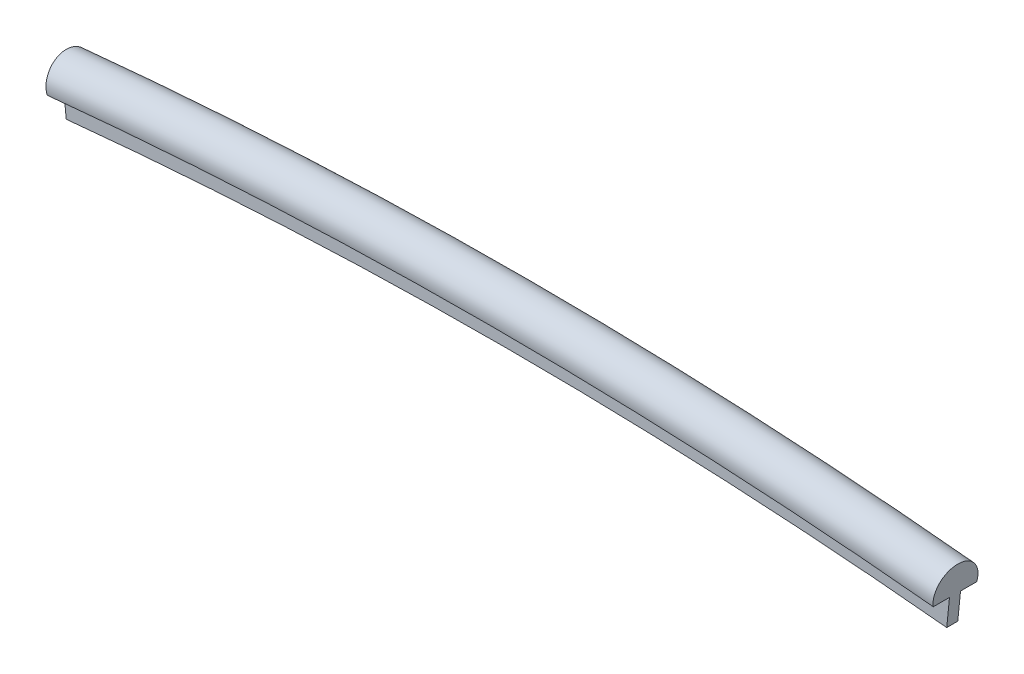
ISO-10303-21;
HEADER;
FILE_DESCRIPTION(('STEP AP214'),'2;1');
FILE_NAME('part.step','',(''),(''),'','','');
FILE_SCHEMA(('AUTOMOTIVE_DESIGN { 1 0 10303 214 1 1 1 1 }'));
ENDSEC;
DATA;
#1=APPLICATION_CONTEXT('core data for automotive mechanical design processes');
#2=APPLICATION_PROTOCOL_DEFINITION('international standard','automotive_design',2000,#1);
#3=PRODUCT_CONTEXT('',#1,'mechanical');
#4=PRODUCT('Part','Part','',(#3));
#5=PRODUCT_RELATED_PRODUCT_CATEGORY('part','',(#4));
#6=PRODUCT_DEFINITION_FORMATION('','',#4);
#7=PRODUCT_DEFINITION_CONTEXT('part definition',#1,'design');
#8=PRODUCT_DEFINITION('design','',#6,#7);
#9=PRODUCT_DEFINITION_SHAPE('','',#8);
#10=(LENGTH_UNIT() NAMED_UNIT(*) SI_UNIT(.MILLI.,.METRE.));
#11=(NAMED_UNIT(*) PLANE_ANGLE_UNIT() SI_UNIT($,.RADIAN.));
#12=(NAMED_UNIT(*) SI_UNIT($,.STERADIAN.) SOLID_ANGLE_UNIT());
#13=UNCERTAINTY_MEASURE_WITH_UNIT(LENGTH_MEASURE(1.E-05),#10,'distance_accuracy_value','');
#14=(GEOMETRIC_REPRESENTATION_CONTEXT(3) GLOBAL_UNCERTAINTY_ASSIGNED_CONTEXT((#13)) GLOBAL_UNIT_ASSIGNED_CONTEXT((#10,
#11,#12)) REPRESENTATION_CONTEXT('',''));
#15=CARTESIAN_POINT('',(0.,0.,0.));
#16=DIRECTION('',(0.,0.,1.));
#17=DIRECTION('',(1.,0.,0.));
#18=AXIS2_PLACEMENT_3D('',#15,#16,#17);
#19=CARTESIAN_POINT('',(0.,0.,70.5976415970385));
#20=DIRECTION('',(0.,0.,1.));
#21=DIRECTION('',(1.,0.,0.));
#22=AXIS2_PLACEMENT_3D('',#19,#20,#21);
#23=CYLINDRICAL_SURFACE('',#22,241.3);
#24=CARTESIAN_POINT('',(0.,0.,1.18));
#25=DIRECTION('',(0.,0.,1.));
#26=DIRECTION('',(1.,0.,0.));
#27=AXIS2_PLACEMENT_3D('',#24,#25,#26);
#28=CIRCLE('',#27,241.3);
#29=CARTESIAN_POINT('',(24.0400729481328,240.09948957182,1.18));
#30=VERTEX_POINT('',#29);
#31=CARTESIAN_POINT('',(-24.0400729481328,240.09948957182,1.18));
#32=VERTEX_POINT('',#31);
#33=EDGE_CURVE('E11',#30,#32,#28,.T.);
#34=ORIENTED_EDGE('',*,*,#33,.T.);
#35=DIRECTION('',(0.,0.,-1.));
#36=VECTOR('',#35,1.);
#37=CARTESIAN_POINT('',(-24.0400729481328,240.09948957182,1.18));
#38=LINE('',#37,#36);
#39=CARTESIAN_POINT('',(-24.0400729481328,240.09948957182,0.3));
#40=VERTEX_POINT('',#39);
#41=EDGE_CURVE('E103',#32,#40,#38,.T.);
#42=ORIENTED_EDGE('',*,*,#41,.T.);
#43=CARTESIAN_POINT('',(0.,0.,0.299999999999995));
#44=DIRECTION('',(0.,0.,1.));
#45=DIRECTION('',(1.,0.,0.));
#46=AXIS2_PLACEMENT_3D('',#43,#44,#45);
#47=CIRCLE('',#46,241.3);
#48=CARTESIAN_POINT('',(24.0400729481328,240.09948957182,0.3));
#49=VERTEX_POINT('',#48);
#50=EDGE_CURVE('E85',#49,#40,#47,.T.);
#51=ORIENTED_EDGE('',*,*,#50,.F.);
#52=DIRECTION('',(0.,0.,-1.));
#53=VECTOR('',#52,1.);
#54=CARTESIAN_POINT('',(24.0400729481328,240.09948957182,1.18));
#55=LINE('',#54,#53);
#56=EDGE_CURVE('E117',#30,#49,#55,.T.);
#57=ORIENTED_EDGE('',*,*,#56,.F.);
#58=EDGE_LOOP('',(#34,#42,#51,#57));
#59=FACE_BOUND('',#58,.T.);
#60=ADVANCED_FACE('F33',(#59),#23,.F.);
#61=CARTESIAN_POINT('',(0.,0.,0.));
#62=DIRECTION('',(0.,0.,1.));
#63=DIRECTION('',(1.,0.,0.));
#64=AXIS2_PLACEMENT_3D('',#61,#62,#63);
#65=TOROIDAL_SURFACE('',#64,241.586013989906,1.21416802890791);
#66=CARTESIAN_POINT('',(0.,0.,-1.18));
#67=DIRECTION('',(0.,0.,1.));
#68=DIRECTION('',(1.,0.,0.));
#69=AXIS2_PLACEMENT_3D('',#66,#67,#68);
#70=CIRCLE('',#69,241.3);
#71=CARTESIAN_POINT('',(24.0400729481328,240.09948957182,-1.18));
#72=VERTEX_POINT('',#71);
#73=CARTESIAN_POINT('',(-24.0400729481328,240.09948957182,-1.18));
#74=VERTEX_POINT('',#73);
#75=EDGE_CURVE('E41',#72,#74,#70,.T.);
#76=ORIENTED_EDGE('',*,*,#75,.T.);
#77=CARTESIAN_POINT('',(-24.068567756179,240.384080591243,0.));
#78=DIRECTION('',(0.995024822096228,0.0996273226196967,0.));
#79=DIRECTION('',(0.,0.,1.));
#80=AXIS2_PLACEMENT_3D('',#77,#78,#79);
#81=CIRCLE('',#80,1.21416802890791);
#82=EDGE_CURVE('E115',#74,#32,#81,.T.);
#83=ORIENTED_EDGE('',*,*,#82,.T.);
#84=ORIENTED_EDGE('',*,*,#33,.F.);
#85=CARTESIAN_POINT('',(24.068567756179,240.384080591243,0.));
#86=DIRECTION('',(0.995024822096228,-0.0996273226196967,0.));
#87=DIRECTION('',(0.,0.,1.));
#88=AXIS2_PLACEMENT_3D('',#85,#86,#87);
#89=CIRCLE('',#88,1.21416802890791);
#90=EDGE_CURVE('E97',#72,#30,#89,.T.);
#91=ORIENTED_EDGE('',*,*,#90,.F.);
#92=EDGE_LOOP('',(#76,#83,#84,#91));
#93=FACE_BOUND('',#92,.T.);
#94=ADVANCED_FACE('F35',(#93),#65,.T.);
#95=CARTESIAN_POINT('',(0.,0.,70.5976415970385));
#96=DIRECTION('',(0.,0.,1.));
#97=DIRECTION('',(1.,0.,0.));
#98=AXIS2_PLACEMENT_3D('',#95,#96,#97);
#99=CYLINDRICAL_SURFACE('',#98,241.3);
#100=CARTESIAN_POINT('',(0.,0.,-0.299999999999995));
#101=DIRECTION('',(0.,0.,1.));
#102=DIRECTION('',(1.,0.,0.));
#103=AXIS2_PLACEMENT_3D('',#100,#101,#102);
#104=CIRCLE('',#103,241.3);
#105=CARTESIAN_POINT('',(24.0400729481328,240.09948957182,-0.3));
#106=VERTEX_POINT('',#105);
#107=CARTESIAN_POINT('',(-24.0400729481328,240.09948957182,-0.3));
#108=VERTEX_POINT('',#107);
#109=EDGE_CURVE('E132',#106,#108,#104,.T.);
#110=ORIENTED_EDGE('',*,*,#109,.T.);
#111=DIRECTION('',(0.,0.,-1.));
#112=VECTOR('',#111,1.);
#113=CARTESIAN_POINT('',(-24.0400729481328,240.09948957182,-0.3));
#114=LINE('',#113,#112);
#115=EDGE_CURVE('E113',#108,#74,#114,.T.);
#116=ORIENTED_EDGE('',*,*,#115,.T.);
#117=ORIENTED_EDGE('',*,*,#75,.F.);
#118=DIRECTION('',(0.,0.,-1.));
#119=VECTOR('',#118,1.);
#120=CARTESIAN_POINT('',(24.0400729481328,240.09948957182,-0.3));
#121=LINE('',#120,#119);
#122=EDGE_CURVE('E125',#106,#72,#121,.T.);
#123=ORIENTED_EDGE('',*,*,#122,.F.);
#124=EDGE_LOOP('',(#110,#116,#117,#123));
#125=FACE_BOUND('',#124,.T.);
#126=ADVANCED_FACE('F134',(#125),#99,.F.);
#127=CARTESIAN_POINT('',(23.8906319642033,238.606952338676,-0.3));
#128=DIRECTION('',(0.,0.,1.));
#129=DIRECTION('',(1.,0.,0.));
#130=AXIS2_PLACEMENT_3D('',#127,#128,#129);
#131=PLANE('',#130);
#132=CARTESIAN_POINT('',(0.,0.,-0.299999999999995));
#133=DIRECTION('',(0.,0.,1.));
#134=DIRECTION('',(1.,0.,0.));
#135=AXIS2_PLACEMENT_3D('',#132,#133,#134);
#136=CIRCLE('',#135,239.8);
#137=CARTESIAN_POINT('',(23.8906319642033,238.606952338676,-0.3));
#138=VERTEX_POINT('',#137);
#139=CARTESIAN_POINT('',(-23.8906319642033,238.606952338676,-0.3));
#140=VERTEX_POINT('',#139);
#141=EDGE_CURVE('E129',#138,#140,#136,.T.);
#142=ORIENTED_EDGE('',*,*,#141,.T.);
#143=DIRECTION('',(-0.0996273226196967,0.995024822096228,0.));
#144=VECTOR('',#143,1.);
#145=CARTESIAN_POINT('',(-23.8906319642033,238.606952338676,-0.3));
#146=LINE('',#145,#144);
#147=EDGE_CURVE('E110',#140,#108,#146,.T.);
#148=ORIENTED_EDGE('',*,*,#147,.T.);
#149=ORIENTED_EDGE('',*,*,#109,.F.);
#150=DIRECTION('',(0.0996273226196967,0.995024822096228,0.));
#151=VECTOR('',#150,1.);
#152=CARTESIAN_POINT('',(23.8906319642033,238.606952338676,-0.3));
#153=LINE('',#152,#151);
#154=EDGE_CURVE('E122',#138,#106,#153,.T.);
#155=ORIENTED_EDGE('',*,*,#154,.F.);
#156=EDGE_LOOP('',(#142,#148,#149,#155));
#157=FACE_BOUND('',#156,.T.);
#158=ADVANCED_FACE('F136',(#157),#131,.F.);
#159=CARTESIAN_POINT('',(0.,0.,70.5976415970385));
#160=DIRECTION('',(0.,0.,1.));
#161=DIRECTION('',(1.,0.,0.));
#162=AXIS2_PLACEMENT_3D('',#159,#160,#161);
#163=CYLINDRICAL_SURFACE('',#162,239.8);
#164=CARTESIAN_POINT('',(0.,0.,0.299999999999995));
#165=DIRECTION('',(0.,0.,1.));
#166=DIRECTION('',(1.,0.,0.));
#167=AXIS2_PLACEMENT_3D('',#164,#165,#166);
#168=CIRCLE('',#167,239.8);
#169=CARTESIAN_POINT('',(23.8906319642033,238.606952338676,0.3));
#170=VERTEX_POINT('',#169);
#171=CARTESIAN_POINT('',(-23.8906319642033,238.606952338676,0.3));
#172=VERTEX_POINT('',#171);
#173=EDGE_CURVE('E96',#170,#172,#168,.T.);
#174=ORIENTED_EDGE('',*,*,#173,.T.);
#175=DIRECTION('',(0.,0.,-1.));
#176=VECTOR('',#175,1.);
#177=CARTESIAN_POINT('',(-23.8906319642033,238.606952338676,0.));
#178=LINE('',#177,#176);
#179=EDGE_CURVE('E105',#172,#140,#178,.T.);
#180=ORIENTED_EDGE('',*,*,#179,.T.);
#181=ORIENTED_EDGE('',*,*,#141,.F.);
#182=DIRECTION('',(0.,0.,-1.));
#183=VECTOR('',#182,1.);
#184=CARTESIAN_POINT('',(23.8906319642033,238.606952338676,0.));
#185=LINE('',#184,#183);
#186=EDGE_CURVE('E120',#170,#138,#185,.T.);
#187=ORIENTED_EDGE('',*,*,#186,.F.);
#188=EDGE_LOOP('',(#174,#180,#181,#187));
#189=FACE_BOUND('',#188,.T.);
#190=ADVANCED_FACE('F141',(#189),#163,.F.);
#191=CARTESIAN_POINT('',(23.8906319642033,238.606952338676,0.3));
#192=DIRECTION('',(0.,0.,-1.));
#193=DIRECTION('',(-1.,0.,0.));
#194=AXIS2_PLACEMENT_3D('',#191,#192,#193);
#195=PLANE('',#194);
#196=DIRECTION('',(-0.0996273226196967,-0.995024822096228,0.));
#197=VECTOR('',#196,1.);
#198=CARTESIAN_POINT('',(23.8906319642033,238.606952338676,0.3));
#199=LINE('',#198,#197);
#200=EDGE_CURVE('E91',#49,#170,#199,.T.);
#201=ORIENTED_EDGE('',*,*,#200,.F.);
#202=ORIENTED_EDGE('',*,*,#50,.T.);
#203=DIRECTION('',(0.0996273226196967,-0.995024822096228,0.));
#204=VECTOR('',#203,1.);
#205=CARTESIAN_POINT('',(-23.8906319642033,238.606952338676,0.3));
#206=LINE('',#205,#204);
#207=EDGE_CURVE('E88',#40,#172,#206,.T.);
#208=ORIENTED_EDGE('',*,*,#207,.T.);
#209=ORIENTED_EDGE('',*,*,#173,.F.);
#210=EDGE_LOOP('',(#201,#202,#208,#209));
#211=FACE_BOUND('',#210,.T.);
#212=ADVANCED_FACE('F87',(#211),#195,.F.);
#213=CARTESIAN_POINT('',(24.068567756179,240.384080591243,0.));
#214=DIRECTION('',(-0.995024822096228,0.0996273226196967,0.));
#215=DIRECTION('',(0.,0.,1.));
#216=AXIS2_PLACEMENT_3D('',#213,#214,#215);
#217=PLANE('',#216);
#218=ORIENTED_EDGE('',*,*,#56,.T.);
#219=ORIENTED_EDGE('',*,*,#200,.T.);
#220=ORIENTED_EDGE('',*,*,#186,.T.);
#221=ORIENTED_EDGE('',*,*,#154,.T.);
#222=ORIENTED_EDGE('',*,*,#122,.T.);
#223=ORIENTED_EDGE('',*,*,#90,.T.);
#224=EDGE_LOOP('',(#218,#219,#220,#221,#222,#223));
#225=FACE_BOUND('',#224,.T.);
#226=ADVANCED_FACE('F143',(#225),#217,.F.);
#227=CARTESIAN_POINT('',(-24.068567756179,240.384080591243,0.));
#228=DIRECTION('',(-0.995024822096228,-0.0996273226196967,0.));
#229=DIRECTION('',(0.,0.,1.));
#230=AXIS2_PLACEMENT_3D('',#227,#228,#229);
#231=PLANE('',#230);
#232=ORIENTED_EDGE('',*,*,#41,.F.);
#233=ORIENTED_EDGE('',*,*,#82,.F.);
#234=ORIENTED_EDGE('',*,*,#115,.F.);
#235=ORIENTED_EDGE('',*,*,#147,.F.);
#236=ORIENTED_EDGE('',*,*,#179,.F.);
#237=ORIENTED_EDGE('',*,*,#207,.F.);
#238=EDGE_LOOP('',(#232,#233,#234,#235,#236,#237));
#239=FACE_BOUND('',#238,.T.);
#240=ADVANCED_FACE('F101',(#239),#231,.T.);
#241=CLOSED_SHELL('',(#60,#94,#126,#158,#190,#212,#226,#240));
#242=MANIFOLD_SOLID_BREP('B2',#241);
#243=ADVANCED_BREP_SHAPE_REPRESENTATION('',(#18,#242),#14);
#244=SHAPE_DEFINITION_REPRESENTATION(#9,#243);
ENDSEC;
END-ISO-10303-21;
